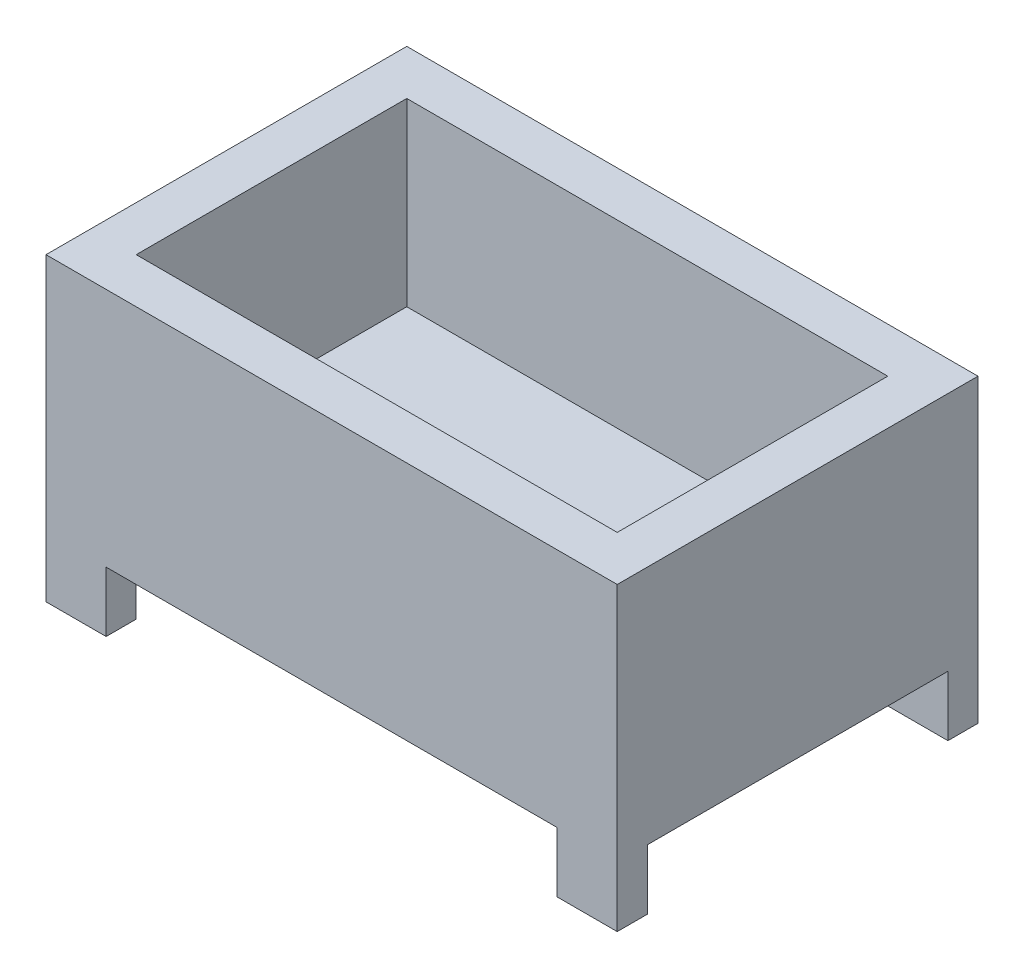
ISO-10303-21;
HEADER;
FILE_DESCRIPTION(('STEP AP214'),'2;1');
FILE_NAME('part.step','',(''),(''),'','','');
FILE_SCHEMA(('AUTOMOTIVE_DESIGN { 1 0 10303 214 1 1 1 1 }'));
ENDSEC;
DATA;
#1=APPLICATION_CONTEXT('core data for automotive mechanical design processes');
#2=APPLICATION_PROTOCOL_DEFINITION('international standard','automotive_design',2000,#1);
#3=PRODUCT_CONTEXT('',#1,'mechanical');
#4=PRODUCT('Part','Part','',(#3));
#5=PRODUCT_RELATED_PRODUCT_CATEGORY('part','',(#4));
#6=PRODUCT_DEFINITION_FORMATION('','',#4);
#7=PRODUCT_DEFINITION_CONTEXT('part definition',#1,'design');
#8=PRODUCT_DEFINITION('design','',#6,#7);
#9=PRODUCT_DEFINITION_SHAPE('','',#8);
#10=(LENGTH_UNIT() NAMED_UNIT(*) SI_UNIT(.MILLI.,.METRE.));
#11=(NAMED_UNIT(*) PLANE_ANGLE_UNIT() SI_UNIT($,.RADIAN.));
#12=(NAMED_UNIT(*) SI_UNIT($,.STERADIAN.) SOLID_ANGLE_UNIT());
#13=UNCERTAINTY_MEASURE_WITH_UNIT(LENGTH_MEASURE(1.E-05),#10,'distance_accuracy_value','');
#14=(GEOMETRIC_REPRESENTATION_CONTEXT(3) GLOBAL_UNCERTAINTY_ASSIGNED_CONTEXT((#13)) GLOBAL_UNIT_ASSIGNED_CONTEXT((#10,
#11,#12)) REPRESENTATION_CONTEXT('',''));
#15=CARTESIAN_POINT('',(0.,0.,0.));
#16=DIRECTION('',(0.,0.,1.));
#17=DIRECTION('',(1.,0.,0.));
#18=AXIS2_PLACEMENT_3D('',#15,#16,#17);
#19=CARTESIAN_POINT('',(0.,0.,0.));
#20=DIRECTION('',(0.,-1.,0.));
#21=DIRECTION('',(0.,0.,-1.));
#22=AXIS2_PLACEMENT_3D('',#19,#20,#21);
#23=PLANE('',#22);
#24=DIRECTION('',(1.,0.,0.));
#25=VECTOR('',#24,1.);
#26=CARTESIAN_POINT('',(0.,0.,-10.));
#27=LINE('',#26,#25);
#28=CARTESIAN_POINT('',(-19.,0.,-10.));
#29=VERTEX_POINT('',#28);
#30=CARTESIAN_POINT('',(-15.,0.,-10.));
#31=VERTEX_POINT('',#30);
#32=EDGE_CURVE('E214',#29,#31,#27,.T.);
#33=ORIENTED_EDGE('',*,*,#32,.F.);
#34=DIRECTION('',(0.,0.,1.));
#35=VECTOR('',#34,1.);
#36=CARTESIAN_POINT('',(-19.,0.,12.));
#37=LINE('',#36,#35);
#38=CARTESIAN_POINT('',(-19.,0.,-12.));
#39=VERTEX_POINT('',#38);
#40=EDGE_CURVE('E280',#39,#29,#37,.T.);
#41=ORIENTED_EDGE('',*,*,#40,.F.);
#42=DIRECTION('',(-1.,0.,0.));
#43=VECTOR('',#42,1.);
#44=CARTESIAN_POINT('',(-19.,0.,-12.));
#45=LINE('',#44,#43);
#46=CARTESIAN_POINT('',(-15.,0.,-12.));
#47=VERTEX_POINT('',#46);
#48=EDGE_CURVE('E290',#47,#39,#45,.T.);
#49=ORIENTED_EDGE('',*,*,#48,.F.);
#50=DIRECTION('',(0.,0.,-1.));
#51=VECTOR('',#50,1.);
#52=CARTESIAN_POINT('',(-15.,0.,0.));
#53=LINE('',#52,#51);
#54=EDGE_CURVE('E308',#31,#47,#53,.T.);
#55=ORIENTED_EDGE('',*,*,#54,.F.);
#56=EDGE_LOOP('',(#33,#41,#49,#55));
#57=FACE_BOUND('',#56,.T.);
#58=ADVANCED_FACE('F33',(#57),#23,.T.);
#59=DIRECTION('',(1.,0.,0.));
#60=VECTOR('',#59,1.);
#61=CARTESIAN_POINT('',(0.,0.,-10.));
#62=LINE('',#61,#60);
#63=CARTESIAN_POINT('',(15.,0.,-10.));
#64=VERTEX_POINT('',#63);
#65=CARTESIAN_POINT('',(19.,0.,-10.));
#66=VERTEX_POINT('',#65);
#67=EDGE_CURVE('E206',#64,#66,#62,.T.);
#68=ORIENTED_EDGE('',*,*,#67,.F.);
#69=DIRECTION('',(0.,0.,1.));
#70=VECTOR('',#69,1.);
#71=CARTESIAN_POINT('',(15.,0.,0.));
#72=LINE('',#71,#70);
#73=CARTESIAN_POINT('',(15.,0.,-12.));
#74=VERTEX_POINT('',#73);
#75=EDGE_CURVE('E305',#74,#64,#72,.T.);
#76=ORIENTED_EDGE('',*,*,#75,.F.);
#77=CARTESIAN_POINT('',(19.,0.,-12.));
#78=VERTEX_POINT('',#77);
#79=EDGE_CURVE('E273',#78,#74,#45,.T.);
#80=ORIENTED_EDGE('',*,*,#79,.F.);
#81=DIRECTION('',(0.,0.,-1.));
#82=VECTOR('',#81,1.);
#83=CARTESIAN_POINT('',(19.,0.,12.));
#84=LINE('',#83,#82);
#85=EDGE_CURVE('E286',#66,#78,#84,.T.);
#86=ORIENTED_EDGE('',*,*,#85,.F.);
#87=EDGE_LOOP('',(#68,#76,#80,#86));
#88=FACE_BOUND('',#87,.T.);
#89=ADVANCED_FACE('F354',(#88),#23,.T.);
#90=CARTESIAN_POINT('',(-15.,-1.,-18.));
#91=DIRECTION('',(-1.,0.,0.));
#92=DIRECTION('',(0.,0.,1.));
#93=AXIS2_PLACEMENT_3D('',#90,#91,#92);
#94=PLANE('',#93);
#95=DIRECTION('',(0.,0.,1.));
#96=VECTOR('',#95,1.);
#97=CARTESIAN_POINT('',(-15.,4.,-18.));
#98=LINE('',#97,#96);
#99=CARTESIAN_POINT('',(-15.,4.,-12.));
#100=VERTEX_POINT('',#99);
#101=CARTESIAN_POINT('',(-15.,4.,-10.));
#102=VERTEX_POINT('',#101);
#103=EDGE_CURVE('E224',#100,#102,#98,.T.);
#104=ORIENTED_EDGE('',*,*,#103,.T.);
#105=DIRECTION('',(0.,-1.,0.));
#106=VECTOR('',#105,1.);
#107=CARTESIAN_POINT('',(-15.,-1.,-10.));
#108=LINE('',#107,#106);
#109=EDGE_CURVE('E211',#102,#31,#108,.T.);
#110=ORIENTED_EDGE('',*,*,#109,.T.);
#111=ORIENTED_EDGE('',*,*,#54,.T.);
#112=DIRECTION('',(0.,-1.,0.));
#113=VECTOR('',#112,1.);
#114=CARTESIAN_POINT('',(-15.,20.,-12.));
#115=LINE('',#114,#113);
#116=EDGE_CURVE('E233',#100,#47,#115,.T.);
#117=ORIENTED_EDGE('',*,*,#116,.F.);
#118=EDGE_LOOP('',(#104,#110,#111,#117));
#119=FACE_BOUND('',#118,.T.);
#120=ADVANCED_FACE('F366',(#119),#94,.F.);
#121=CARTESIAN_POINT('',(15.,-1.,-18.));
#122=DIRECTION('',(1.,0.,0.));
#123=DIRECTION('',(0.,0.,-1.));
#124=AXIS2_PLACEMENT_3D('',#121,#122,#123);
#125=PLANE('',#124);
#126=ORIENTED_EDGE('',*,*,#75,.T.);
#127=DIRECTION('',(0.,1.,0.));
#128=VECTOR('',#127,1.);
#129=CARTESIAN_POINT('',(15.,-1.,-10.));
#130=LINE('',#129,#128);
#131=CARTESIAN_POINT('',(15.,4.,-10.));
#132=VERTEX_POINT('',#131);
#133=EDGE_CURVE('E11',#64,#132,#130,.T.);
#134=ORIENTED_EDGE('',*,*,#133,.T.);
#135=DIRECTION('',(0.,0.,1.));
#136=VECTOR('',#135,1.);
#137=CARTESIAN_POINT('',(15.,4.,-18.));
#138=LINE('',#137,#136);
#139=CARTESIAN_POINT('',(15.,4.,-12.));
#140=VERTEX_POINT('',#139);
#141=EDGE_CURVE('E228',#140,#132,#138,.T.);
#142=ORIENTED_EDGE('',*,*,#141,.F.);
#143=DIRECTION('',(0.,1.,0.));
#144=VECTOR('',#143,1.);
#145=CARTESIAN_POINT('',(15.,20.,-12.));
#146=LINE('',#145,#144);
#147=EDGE_CURVE('E227',#74,#140,#146,.T.);
#148=ORIENTED_EDGE('',*,*,#147,.F.);
#149=EDGE_LOOP('',(#126,#134,#142,#148));
#150=FACE_BOUND('',#149,.T.);
#151=ADVANCED_FACE('F370',(#150),#125,.F.);
#152=DIRECTION('',(-1.,0.,0.));
#153=VECTOR('',#152,1.);
#154=CARTESIAN_POINT('',(0.,0.,10.));
#155=LINE('',#154,#153);
#156=CARTESIAN_POINT('',(-15.,0.,10.));
#157=VERTEX_POINT('',#156);
#158=CARTESIAN_POINT('',(-19.,0.,10.));
#159=VERTEX_POINT('',#158);
#160=EDGE_CURVE('E184',#157,#159,#155,.T.);
#161=ORIENTED_EDGE('',*,*,#160,.F.);
#162=CARTESIAN_POINT('',(-15.,0.,12.));
#163=VERTEX_POINT('',#162);
#164=EDGE_CURVE('E309',#163,#157,#53,.T.);
#165=ORIENTED_EDGE('',*,*,#164,.F.);
#166=DIRECTION('',(1.,0.,0.));
#167=VECTOR('',#166,1.);
#168=CARTESIAN_POINT('',(-19.,0.,12.));
#169=LINE('',#168,#167);
#170=CARTESIAN_POINT('',(-19.,0.,12.));
#171=VERTEX_POINT('',#170);
#172=EDGE_CURVE('E283',#171,#163,#169,.T.);
#173=ORIENTED_EDGE('',*,*,#172,.F.);
#174=EDGE_CURVE('E262',#159,#171,#37,.T.);
#175=ORIENTED_EDGE('',*,*,#174,.F.);
#176=EDGE_LOOP('',(#161,#165,#173,#175));
#177=FACE_BOUND('',#176,.T.);
#178=ADVANCED_FACE('F344',(#177),#23,.T.);
#179=CARTESIAN_POINT('',(-19.,20.,12.));
#180=DIRECTION('',(1.,0.,0.));
#181=DIRECTION('',(0.,0.,-1.));
#182=AXIS2_PLACEMENT_3D('',#179,#180,#181);
#183=PLANE('',#182);
#184=ORIENTED_EDGE('',*,*,#40,.T.);
#185=DIRECTION('',(0.,-1.,0.));
#186=VECTOR('',#185,1.);
#187=CARTESIAN_POINT('',(-19.,-1.,-10.));
#188=LINE('',#187,#186);
#189=CARTESIAN_POINT('',(-19.,4.,-10.));
#190=VERTEX_POINT('',#189);
#191=EDGE_CURVE('E187',#190,#29,#188,.T.);
#192=ORIENTED_EDGE('',*,*,#191,.F.);
#193=DIRECTION('',(0.,0.,-1.));
#194=VECTOR('',#193,1.);
#195=CARTESIAN_POINT('',(-19.,4.,-10.));
#196=LINE('',#195,#194);
#197=CARTESIAN_POINT('',(-19.,4.,10.));
#198=VERTEX_POINT('',#197);
#199=EDGE_CURVE('E174',#198,#190,#196,.T.);
#200=ORIENTED_EDGE('',*,*,#199,.F.);
#201=DIRECTION('',(0.,1.,0.));
#202=VECTOR('',#201,1.);
#203=CARTESIAN_POINT('',(-19.,-1.,10.));
#204=LINE('',#203,#202);
#205=EDGE_CURVE('E181',#159,#198,#204,.T.);
#206=ORIENTED_EDGE('',*,*,#205,.F.);
#207=ORIENTED_EDGE('',*,*,#174,.T.);
#208=DIRECTION('',(0.,-1.,0.));
#209=VECTOR('',#208,1.);
#210=CARTESIAN_POINT('',(-19.,20.,12.));
#211=LINE('',#210,#209);
#212=CARTESIAN_POINT('',(-19.,20.,12.));
#213=VERTEX_POINT('',#212);
#214=EDGE_CURVE('E301',#213,#171,#211,.T.);
#215=ORIENTED_EDGE('',*,*,#214,.F.);
#216=DIRECTION('',(0.,0.,1.));
#217=VECTOR('',#216,1.);
#218=CARTESIAN_POINT('',(-19.,20.,12.));
#219=LINE('',#218,#217);
#220=CARTESIAN_POINT('',(-19.,20.,-12.));
#221=VERTEX_POINT('',#220);
#222=EDGE_CURVE('E269',#221,#213,#219,.T.);
#223=ORIENTED_EDGE('',*,*,#222,.F.);
#224=DIRECTION('',(0.,-1.,0.));
#225=VECTOR('',#224,1.);
#226=CARTESIAN_POINT('',(-19.,20.,-12.));
#227=LINE('',#226,#225);
#228=EDGE_CURVE('E279',#221,#39,#227,.T.);
#229=ORIENTED_EDGE('',*,*,#228,.T.);
#230=EDGE_LOOP('',(#184,#192,#200,#206,#207,#215,#223,#229));
#231=FACE_BOUND('',#230,.T.);
#232=ADVANCED_FACE('F35',(#231),#183,.F.);
#233=CARTESIAN_POINT('',(-19.,20.,12.));
#234=DIRECTION('',(0.,0.,-1.));
#235=DIRECTION('',(-1.,0.,0.));
#236=AXIS2_PLACEMENT_3D('',#233,#234,#235);
#237=PLANE('',#236);
#238=ORIENTED_EDGE('',*,*,#172,.T.);
#239=DIRECTION('',(0.,-1.,0.));
#240=VECTOR('',#239,1.);
#241=CARTESIAN_POINT('',(-15.,-1.,12.));
#242=LINE('',#241,#240);
#243=CARTESIAN_POINT('',(-15.,4.,12.));
#244=VERTEX_POINT('',#243);
#245=EDGE_CURVE('E216',#244,#163,#242,.T.);
#246=ORIENTED_EDGE('',*,*,#245,.F.);
#247=DIRECTION('',(-1.,0.,0.));
#248=VECTOR('',#247,1.);
#249=CARTESIAN_POINT('',(-15.,4.,12.));
#250=LINE('',#249,#248);
#251=CARTESIAN_POINT('',(15.,4.,12.));
#252=VERTEX_POINT('',#251);
#253=EDGE_CURVE('E221',#252,#244,#250,.T.);
#254=ORIENTED_EDGE('',*,*,#253,.F.);
#255=DIRECTION('',(0.,1.,0.));
#256=VECTOR('',#255,1.);
#257=CARTESIAN_POINT('',(15.,-1.,12.));
#258=LINE('',#257,#256);
#259=CARTESIAN_POINT('',(15.,0.,12.));
#260=VERTEX_POINT('',#259);
#261=EDGE_CURVE('E218',#260,#252,#258,.T.);
#262=ORIENTED_EDGE('',*,*,#261,.F.);
#263=CARTESIAN_POINT('',(19.,0.,12.));
#264=VERTEX_POINT('',#263);
#265=EDGE_CURVE('E282',#260,#264,#169,.T.);
#266=ORIENTED_EDGE('',*,*,#265,.T.);
#267=DIRECTION('',(0.,-1.,0.));
#268=VECTOR('',#267,1.);
#269=CARTESIAN_POINT('',(19.,20.,12.));
#270=LINE('',#269,#268);
#271=CARTESIAN_POINT('',(19.,20.,12.));
#272=VERTEX_POINT('',#271);
#273=EDGE_CURVE('E298',#272,#264,#270,.T.);
#274=ORIENTED_EDGE('',*,*,#273,.F.);
#275=DIRECTION('',(1.,0.,0.));
#276=VECTOR('',#275,1.);
#277=CARTESIAN_POINT('',(-19.,20.,12.));
#278=LINE('',#277,#276);
#279=EDGE_CURVE('E272',#213,#272,#278,.T.);
#280=ORIENTED_EDGE('',*,*,#279,.F.);
#281=ORIENTED_EDGE('',*,*,#214,.T.);
#282=EDGE_LOOP('',(#238,#246,#254,#262,#266,#274,#280,#281));
#283=FACE_BOUND('',#282,.T.);
#284=ADVANCED_FACE('F328',(#283),#237,.F.);
#285=CARTESIAN_POINT('',(19.,20.,12.));
#286=DIRECTION('',(-1.,0.,0.));
#287=DIRECTION('',(0.,0.,1.));
#288=AXIS2_PLACEMENT_3D('',#285,#286,#287);
#289=PLANE('',#288);
#290=DIRECTION('',(0.,0.,-1.));
#291=VECTOR('',#290,1.);
#292=CARTESIAN_POINT('',(19.,4.,12.));
#293=LINE('',#292,#291);
#294=CARTESIAN_POINT('',(19.,4.,10.));
#295=VERTEX_POINT('',#294);
#296=CARTESIAN_POINT('',(19.,4.,-10.));
#297=VERTEX_POINT('',#296);
#298=EDGE_CURVE('E203',#295,#297,#293,.T.);
#299=ORIENTED_EDGE('',*,*,#298,.T.);
#300=DIRECTION('',(0.,-1.,0.));
#301=VECTOR('',#300,1.);
#302=CARTESIAN_POINT('',(19.,20.,-10.));
#303=LINE('',#302,#301);
#304=EDGE_CURVE('E208',#297,#66,#303,.T.);
#305=ORIENTED_EDGE('',*,*,#304,.T.);
#306=ORIENTED_EDGE('',*,*,#85,.T.);
#307=DIRECTION('',(0.,-1.,0.));
#308=VECTOR('',#307,1.);
#309=CARTESIAN_POINT('',(19.,20.,-12.));
#310=LINE('',#309,#308);
#311=CARTESIAN_POINT('',(19.,20.,-12.));
#312=VERTEX_POINT('',#311);
#313=EDGE_CURVE('E295',#312,#78,#310,.T.);
#314=ORIENTED_EDGE('',*,*,#313,.F.);
#315=DIRECTION('',(0.,0.,-1.));
#316=VECTOR('',#315,1.);
#317=CARTESIAN_POINT('',(19.,20.,12.));
#318=LINE('',#317,#316);
#319=EDGE_CURVE('E275',#272,#312,#318,.T.);
#320=ORIENTED_EDGE('',*,*,#319,.F.);
#321=ORIENTED_EDGE('',*,*,#273,.T.);
#322=CARTESIAN_POINT('',(19.,0.,10.));
#323=VERTEX_POINT('',#322);
#324=EDGE_CURVE('E287',#264,#323,#84,.T.);
#325=ORIENTED_EDGE('',*,*,#324,.T.);
#326=DIRECTION('',(0.,1.,0.));
#327=VECTOR('',#326,1.);
#328=CARTESIAN_POINT('',(19.,20.,10.));
#329=LINE('',#328,#327);
#330=EDGE_CURVE('E197',#323,#295,#329,.T.);
#331=ORIENTED_EDGE('',*,*,#330,.T.);
#332=EDGE_LOOP('',(#299,#305,#306,#314,#320,#321,#325,#331));
#333=FACE_BOUND('',#332,.T.);
#334=ADVANCED_FACE('F332',(#333),#289,.F.);
#335=CARTESIAN_POINT('',(-19.,20.,-12.));
#336=DIRECTION('',(0.,0.,1.));
#337=DIRECTION('',(1.,0.,0.));
#338=AXIS2_PLACEMENT_3D('',#335,#336,#337);
#339=PLANE('',#338);
#340=DIRECTION('',(-1.,0.,0.));
#341=VECTOR('',#340,1.);
#342=CARTESIAN_POINT('',(-19.,4.,-12.));
#343=LINE('',#342,#341);
#344=EDGE_CURVE('E312',#140,#100,#343,.T.);
#345=ORIENTED_EDGE('',*,*,#344,.T.);
#346=ORIENTED_EDGE('',*,*,#116,.T.);
#347=ORIENTED_EDGE('',*,*,#48,.T.);
#348=ORIENTED_EDGE('',*,*,#228,.F.);
#349=DIRECTION('',(-1.,0.,0.));
#350=VECTOR('',#349,1.);
#351=CARTESIAN_POINT('',(-19.,20.,-12.));
#352=LINE('',#351,#350);
#353=EDGE_CURVE('E277',#312,#221,#352,.T.);
#354=ORIENTED_EDGE('',*,*,#353,.F.);
#355=ORIENTED_EDGE('',*,*,#313,.T.);
#356=ORIENTED_EDGE('',*,*,#79,.T.);
#357=ORIENTED_EDGE('',*,*,#147,.T.);
#358=EDGE_LOOP('',(#345,#346,#347,#348,#354,#355,#356,#357));
#359=FACE_BOUND('',#358,.T.);
#360=ADVANCED_FACE('F357',(#359),#339,.F.);
#361=CARTESIAN_POINT('',(0.,20.,0.));
#362=DIRECTION('',(0.,-1.,0.));
#363=DIRECTION('',(0.,0.,-1.));
#364=AXIS2_PLACEMENT_3D('',#361,#362,#363);
#365=PLANE('',#364);
#366=DIRECTION('',(0.,0.,1.));
#367=VECTOR('',#366,1.);
#368=CARTESIAN_POINT('',(-16.,20.,-9.));
#369=LINE('',#368,#367);
#370=CARTESIAN_POINT('',(-16.,20.,-9.));
#371=VERTEX_POINT('',#370);
#372=CARTESIAN_POINT('',(-16.,20.,9.));
#373=VERTEX_POINT('',#372);
#374=EDGE_CURVE('E252',#371,#373,#369,.T.);
#375=ORIENTED_EDGE('',*,*,#374,.F.);
#376=DIRECTION('',(-1.,0.,0.));
#377=VECTOR('',#376,1.);
#378=CARTESIAN_POINT('',(16.,20.,-9.));
#379=LINE('',#378,#377);
#380=CARTESIAN_POINT('',(16.,20.,-9.));
#381=VERTEX_POINT('',#380);
#382=EDGE_CURVE('E236',#381,#371,#379,.T.);
#383=ORIENTED_EDGE('',*,*,#382,.F.);
#384=DIRECTION('',(0.,0.,-1.));
#385=VECTOR('',#384,1.);
#386=CARTESIAN_POINT('',(16.,20.,9.));
#387=LINE('',#386,#385);
#388=CARTESIAN_POINT('',(16.,20.,9.));
#389=VERTEX_POINT('',#388);
#390=EDGE_CURVE('E241',#389,#381,#387,.T.);
#391=ORIENTED_EDGE('',*,*,#390,.F.);
#392=DIRECTION('',(1.,0.,0.));
#393=VECTOR('',#392,1.);
#394=CARTESIAN_POINT('',(-16.,20.,9.));
#395=LINE('',#394,#393);
#396=EDGE_CURVE('E255',#373,#389,#395,.T.);
#397=ORIENTED_EDGE('',*,*,#396,.F.);
#398=EDGE_LOOP('',(#375,#383,#391,#397));
#399=FACE_BOUND('',#398,.T.);
#400=ORIENTED_EDGE('',*,*,#222,.T.);
#401=ORIENTED_EDGE('',*,*,#279,.T.);
#402=ORIENTED_EDGE('',*,*,#319,.T.);
#403=ORIENTED_EDGE('',*,*,#353,.T.);
#404=EDGE_LOOP('',(#400,#401,#402,#403));
#405=FACE_BOUND('',#404,.T.);
#406=ADVANCED_FACE('F336',(#399,#405),#365,.F.);
#407=DIRECTION('',(-1.,0.,0.));
#408=VECTOR('',#407,1.);
#409=CARTESIAN_POINT('',(0.,0.,10.));
#410=LINE('',#409,#408);
#411=CARTESIAN_POINT('',(15.,0.,10.));
#412=VERTEX_POINT('',#411);
#413=EDGE_CURVE('E57',#323,#412,#410,.T.);
#414=ORIENTED_EDGE('',*,*,#413,.F.);
#415=ORIENTED_EDGE('',*,*,#324,.F.);
#416=ORIENTED_EDGE('',*,*,#265,.F.);
#417=EDGE_CURVE('E304',#412,#260,#72,.T.);
#418=ORIENTED_EDGE('',*,*,#417,.F.);
#419=EDGE_LOOP('',(#414,#415,#416,#418));
#420=FACE_BOUND('',#419,.T.);
#421=ADVANCED_FACE('F324',(#420),#23,.T.);
#422=CARTESIAN_POINT('',(16.,8.,-9.));
#423=DIRECTION('',(0.,0.,-1.));
#424=DIRECTION('',(-1.,0.,0.));
#425=AXIS2_PLACEMENT_3D('',#422,#423,#424);
#426=PLANE('',#425);
#427=ORIENTED_EDGE('',*,*,#382,.T.);
#428=DIRECTION('',(0.,1.,0.));
#429=VECTOR('',#428,1.);
#430=CARTESIAN_POINT('',(-16.,8.,-9.));
#431=LINE('',#430,#429);
#432=CARTESIAN_POINT('',(-16.,8.,-9.));
#433=VERTEX_POINT('',#432);
#434=EDGE_CURVE('E250',#433,#371,#431,.T.);
#435=ORIENTED_EDGE('',*,*,#434,.F.);
#436=DIRECTION('',(-1.,0.,0.));
#437=VECTOR('',#436,1.);
#438=CARTESIAN_POINT('',(16.,8.,-9.));
#439=LINE('',#438,#437);
#440=CARTESIAN_POINT('',(16.,8.,-9.));
#441=VERTEX_POINT('',#440);
#442=EDGE_CURVE('E237',#441,#433,#439,.T.);
#443=ORIENTED_EDGE('',*,*,#442,.F.);
#444=DIRECTION('',(0.,1.,0.));
#445=VECTOR('',#444,1.);
#446=CARTESIAN_POINT('',(16.,8.,-9.));
#447=LINE('',#446,#445);
#448=EDGE_CURVE('E260',#441,#381,#447,.T.);
#449=ORIENTED_EDGE('',*,*,#448,.T.);
#450=EDGE_LOOP('',(#427,#435,#443,#449));
#451=FACE_BOUND('',#450,.T.);
#452=ADVANCED_FACE('F388',(#451),#426,.F.);
#453=CARTESIAN_POINT('',(16.,8.,9.));
#454=DIRECTION('',(1.,0.,0.));
#455=DIRECTION('',(0.,0.,-1.));
#456=AXIS2_PLACEMENT_3D('',#453,#454,#455);
#457=PLANE('',#456);
#458=ORIENTED_EDGE('',*,*,#390,.T.);
#459=ORIENTED_EDGE('',*,*,#448,.F.);
#460=DIRECTION('',(0.,0.,-1.));
#461=VECTOR('',#460,1.);
#462=CARTESIAN_POINT('',(16.,8.,9.));
#463=LINE('',#462,#461);
#464=CARTESIAN_POINT('',(16.,8.,9.));
#465=VERTEX_POINT('',#464);
#466=EDGE_CURVE('E247',#465,#441,#463,.T.);
#467=ORIENTED_EDGE('',*,*,#466,.F.);
#468=DIRECTION('',(0.,1.,0.));
#469=VECTOR('',#468,1.);
#470=CARTESIAN_POINT('',(16.,8.,9.));
#471=LINE('',#470,#469);
#472=EDGE_CURVE('E263',#465,#389,#471,.T.);
#473=ORIENTED_EDGE('',*,*,#472,.T.);
#474=EDGE_LOOP('',(#458,#459,#467,#473));
#475=FACE_BOUND('',#474,.T.);
#476=ADVANCED_FACE('F393',(#475),#457,.F.);
#477=CARTESIAN_POINT('',(-16.,8.,9.));
#478=DIRECTION('',(0.,0.,1.));
#479=DIRECTION('',(1.,0.,0.));
#480=AXIS2_PLACEMENT_3D('',#477,#478,#479);
#481=PLANE('',#480);
#482=ORIENTED_EDGE('',*,*,#396,.T.);
#483=ORIENTED_EDGE('',*,*,#472,.F.);
#484=DIRECTION('',(1.,0.,0.));
#485=VECTOR('',#484,1.);
#486=CARTESIAN_POINT('',(-16.,8.,9.));
#487=LINE('',#486,#485);
#488=CARTESIAN_POINT('',(-16.,8.,9.));
#489=VERTEX_POINT('',#488);
#490=EDGE_CURVE('E244',#489,#465,#487,.T.);
#491=ORIENTED_EDGE('',*,*,#490,.F.);
#492=DIRECTION('',(0.,1.,0.));
#493=VECTOR('',#492,1.);
#494=CARTESIAN_POINT('',(-16.,8.,9.));
#495=LINE('',#494,#493);
#496=EDGE_CURVE('E265',#489,#373,#495,.T.);
#497=ORIENTED_EDGE('',*,*,#496,.T.);
#498=EDGE_LOOP('',(#482,#483,#491,#497));
#499=FACE_BOUND('',#498,.T.);
#500=ADVANCED_FACE('F423',(#499),#481,.F.);
#501=CARTESIAN_POINT('',(-16.,8.,-9.));
#502=DIRECTION('',(-1.,0.,0.));
#503=DIRECTION('',(0.,0.,1.));
#504=AXIS2_PLACEMENT_3D('',#501,#502,#503);
#505=PLANE('',#504);
#506=ORIENTED_EDGE('',*,*,#374,.T.);
#507=ORIENTED_EDGE('',*,*,#496,.F.);
#508=DIRECTION('',(0.,0.,1.));
#509=VECTOR('',#508,1.);
#510=CARTESIAN_POINT('',(-16.,8.,-9.));
#511=LINE('',#510,#509);
#512=EDGE_CURVE('E240',#433,#489,#511,.T.);
#513=ORIENTED_EDGE('',*,*,#512,.F.);
#514=ORIENTED_EDGE('',*,*,#434,.T.);
#515=EDGE_LOOP('',(#506,#507,#513,#514));
#516=FACE_BOUND('',#515,.T.);
#517=ADVANCED_FACE('F419',(#516),#505,.F.);
#518=CARTESIAN_POINT('',(0.,8.,0.));
#519=DIRECTION('',(0.,1.,0.));
#520=DIRECTION('',(0.,0.,1.));
#521=AXIS2_PLACEMENT_3D('',#518,#519,#520);
#522=PLANE('',#521);
#523=CARTESIAN_POINT('',(0.,8.,0.));
#524=DIRECTION('',(0.,1.,0.));
#525=DIRECTION('',(0.,0.,1.));
#526=AXIS2_PLACEMENT_3D('',#523,#524,#525);
#527=CIRCLE('',#526,2.5);
#528=CARTESIAN_POINT('',(0.,8.,2.5));
#529=VERTEX_POINT('',#528);
#530=EDGE_CURVE('E584',#529,#529,#527,.T.);
#531=ORIENTED_EDGE('',*,*,#530,.F.);
#532=EDGE_LOOP('',(#531));
#533=FACE_BOUND('',#532,.T.);
#534=ORIENTED_EDGE('',*,*,#442,.T.);
#535=ORIENTED_EDGE('',*,*,#512,.T.);
#536=ORIENTED_EDGE('',*,*,#490,.T.);
#537=ORIENTED_EDGE('',*,*,#466,.T.);
#538=EDGE_LOOP('',(#534,#535,#536,#537));
#539=FACE_BOUND('',#538,.T.);
#540=ADVANCED_FACE('F414',(#533,#539),#522,.T.);
#541=CARTESIAN_POINT('',(-15.,4.,-18.));
#542=DIRECTION('',(0.,1.,0.));
#543=DIRECTION('',(0.,0.,1.));
#544=AXIS2_PLACEMENT_3D('',#541,#542,#543);
#545=PLANE('',#544);
#546=CARTESIAN_POINT('',(0.,4.,0.));
#547=DIRECTION('',(0.,1.,0.));
#548=DIRECTION('',(0.,0.,1.));
#549=AXIS2_PLACEMENT_3D('',#546,#547,#548);
#550=CIRCLE('',#549,2.5);
#551=CARTESIAN_POINT('',(0.,4.,2.5));
#552=VERTEX_POINT('',#551);
#553=EDGE_CURVE('E37',#552,#552,#550,.T.);
#554=ORIENTED_EDGE('',*,*,#553,.T.);
#555=EDGE_LOOP('',(#554));
#556=FACE_BOUND('',#555,.T.);
#557=CARTESIAN_POINT('',(-15.,4.,10.));
#558=VERTEX_POINT('',#557);
#559=EDGE_CURVE('E177',#558,#244,#98,.T.);
#560=ORIENTED_EDGE('',*,*,#559,.F.);
#561=DIRECTION('',(-1.,0.,0.));
#562=VECTOR('',#561,1.);
#563=CARTESIAN_POINT('',(41.,4.,10.));
#564=LINE('',#563,#562);
#565=EDGE_CURVE('E49',#558,#198,#564,.T.);
#566=ORIENTED_EDGE('',*,*,#565,.T.);
#567=ORIENTED_EDGE('',*,*,#199,.T.);
#568=DIRECTION('',(-1.,0.,0.));
#569=VECTOR('',#568,1.);
#570=CARTESIAN_POINT('',(41.,4.,-10.));
#571=LINE('',#570,#569);
#572=EDGE_CURVE('E193',#102,#190,#571,.T.);
#573=ORIENTED_EDGE('',*,*,#572,.F.);
#574=ORIENTED_EDGE('',*,*,#103,.F.);
#575=ORIENTED_EDGE('',*,*,#344,.F.);
#576=ORIENTED_EDGE('',*,*,#141,.T.);
#577=EDGE_CURVE('E194',#297,#132,#571,.T.);
#578=ORIENTED_EDGE('',*,*,#577,.F.);
#579=ORIENTED_EDGE('',*,*,#298,.F.);
#580=CARTESIAN_POINT('',(15.,4.,10.));
#581=VERTEX_POINT('',#580);
#582=EDGE_CURVE('E178',#295,#581,#564,.T.);
#583=ORIENTED_EDGE('',*,*,#582,.T.);
#584=EDGE_CURVE('E223',#581,#252,#138,.T.);
#585=ORIENTED_EDGE('',*,*,#584,.T.);
#586=ORIENTED_EDGE('',*,*,#253,.T.);
#587=EDGE_LOOP('',(#560,#566,#567,#573,#574,#575,#576,#578,#579,#583,#585,#586));
#588=FACE_BOUND('',#587,.T.);
#589=ADVANCED_FACE('F171',(#556,#588),#545,.F.);
#590=ORIENTED_EDGE('',*,*,#164,.T.);
#591=DIRECTION('',(0.,1.,0.));
#592=VECTOR('',#591,1.);
#593=CARTESIAN_POINT('',(-15.,-1.00000000000001,10.));
#594=LINE('',#593,#592);
#595=EDGE_CURVE('E200',#157,#558,#594,.T.);
#596=ORIENTED_EDGE('',*,*,#595,.T.);
#597=ORIENTED_EDGE('',*,*,#559,.T.);
#598=ORIENTED_EDGE('',*,*,#245,.T.);
#599=EDGE_LOOP('',(#590,#596,#597,#598));
#600=FACE_BOUND('',#599,.T.);
#601=ADVANCED_FACE('F346',(#600),#94,.F.);
#602=ORIENTED_EDGE('',*,*,#584,.F.);
#603=DIRECTION('',(0.,-1.,0.));
#604=VECTOR('',#603,1.);
#605=CARTESIAN_POINT('',(15.,-1.00000000000001,10.));
#606=LINE('',#605,#604);
#607=EDGE_CURVE('E42',#581,#412,#606,.T.);
#608=ORIENTED_EDGE('',*,*,#607,.T.);
#609=ORIENTED_EDGE('',*,*,#417,.T.);
#610=ORIENTED_EDGE('',*,*,#261,.T.);
#611=EDGE_LOOP('',(#602,#608,#609,#610));
#612=FACE_BOUND('',#611,.T.);
#613=ADVANCED_FACE('F318',(#612),#125,.F.);
#614=CARTESIAN_POINT('',(41.,-1.,10.));
#615=DIRECTION('',(0.,0.,1.));
#616=DIRECTION('',(0.,-1.,0.));
#617=AXIS2_PLACEMENT_3D('',#614,#615,#616);
#618=PLANE('',#617);
#619=ORIENTED_EDGE('',*,*,#413,.T.);
#620=ORIENTED_EDGE('',*,*,#607,.F.);
#621=ORIENTED_EDGE('',*,*,#582,.F.);
#622=ORIENTED_EDGE('',*,*,#330,.F.);
#623=EDGE_LOOP('',(#619,#620,#621,#622));
#624=FACE_BOUND('',#623,.T.);
#625=ADVANCED_FACE('F348',(#624),#618,.F.);
#626=CARTESIAN_POINT('',(41.,-1.,-10.));
#627=DIRECTION('',(0.,0.,-1.));
#628=DIRECTION('',(-1.,0.,0.));
#629=AXIS2_PLACEMENT_3D('',#626,#627,#628);
#630=PLANE('',#629);
#631=ORIENTED_EDGE('',*,*,#577,.T.);
#632=ORIENTED_EDGE('',*,*,#133,.F.);
#633=ORIENTED_EDGE('',*,*,#67,.T.);
#634=ORIENTED_EDGE('',*,*,#304,.F.);
#635=EDGE_LOOP('',(#631,#632,#633,#634));
#636=FACE_BOUND('',#635,.T.);
#637=ADVANCED_FACE('F371',(#636),#630,.F.);
#638=ORIENTED_EDGE('',*,*,#32,.T.);
#639=ORIENTED_EDGE('',*,*,#109,.F.);
#640=ORIENTED_EDGE('',*,*,#572,.T.);
#641=ORIENTED_EDGE('',*,*,#191,.T.);
#642=EDGE_LOOP('',(#638,#639,#640,#641));
#643=FACE_BOUND('',#642,.T.);
#644=ADVANCED_FACE('F364',(#643),#630,.F.);
#645=ORIENTED_EDGE('',*,*,#160,.T.);
#646=ORIENTED_EDGE('',*,*,#205,.T.);
#647=ORIENTED_EDGE('',*,*,#565,.F.);
#648=ORIENTED_EDGE('',*,*,#595,.F.);
#649=EDGE_LOOP('',(#645,#646,#647,#648));
#650=FACE_BOUND('',#649,.T.);
#651=ADVANCED_FACE('F182',(#650),#618,.F.);
#652=CARTESIAN_POINT('',(0.,-52.,0.));
#653=DIRECTION('',(0.,1.,0.));
#654=DIRECTION('',(0.,0.,1.));
#655=AXIS2_PLACEMENT_3D('',#652,#653,#654);
#656=CYLINDRICAL_SURFACE('',#655,2.5);
#657=ORIENTED_EDGE('',*,*,#530,.T.);
#658=EDGE_LOOP('',(#657));
#659=FACE_BOUND('',#658,.T.);
#660=ORIENTED_EDGE('',*,*,#553,.F.);
#661=EDGE_LOOP('',(#660));
#662=FACE_BOUND('',#661,.T.);
#663=ADVANCED_FACE('F461',(#659,#662),#656,.F.);
#664=CLOSED_SHELL('',(#58,#89,#120,#151,#178,#232,#284,#334,#360,#406,#421,#452,#476,#500,#517,
#540,#589,#601,#613,#625,#637,#644,#651,#663));
#665=MANIFOLD_SOLID_BREP('B2',#664);
#666=ADVANCED_BREP_SHAPE_REPRESENTATION('',(#18,#665),#14);
#667=SHAPE_DEFINITION_REPRESENTATION(#9,#666);
ENDSEC;
END-ISO-10303-21;
